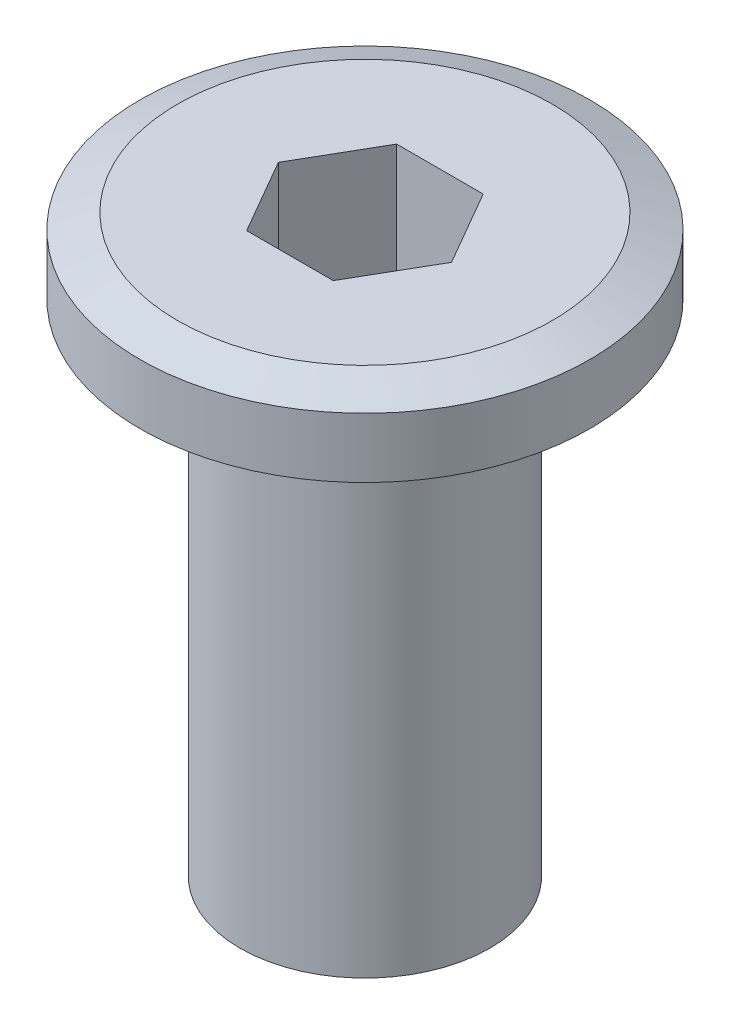
ISO-10303-21;
HEADER;
FILE_DESCRIPTION(('STEP AP214'),'2;1');
FILE_NAME('part.step','',(''),(''),'','','');
FILE_SCHEMA(('AUTOMOTIVE_DESIGN { 1 0 10303 214 1 1 1 1 }'));
ENDSEC;
DATA;
#1=APPLICATION_CONTEXT('core data for automotive mechanical design processes');
#2=APPLICATION_PROTOCOL_DEFINITION('international standard','automotive_design',2000,#1);
#3=PRODUCT_CONTEXT('',#1,'mechanical');
#4=PRODUCT('Part','Part','',(#3));
#5=PRODUCT_RELATED_PRODUCT_CATEGORY('part','',(#4));
#6=PRODUCT_DEFINITION_FORMATION('','',#4);
#7=PRODUCT_DEFINITION_CONTEXT('part definition',#1,'design');
#8=PRODUCT_DEFINITION('design','',#6,#7);
#9=PRODUCT_DEFINITION_SHAPE('','',#8);
#10=(LENGTH_UNIT() NAMED_UNIT(*) SI_UNIT(.MILLI.,.METRE.));
#11=(NAMED_UNIT(*) PLANE_ANGLE_UNIT() SI_UNIT($,.RADIAN.));
#12=(NAMED_UNIT(*) SI_UNIT($,.STERADIAN.) SOLID_ANGLE_UNIT());
#13=UNCERTAINTY_MEASURE_WITH_UNIT(LENGTH_MEASURE(1.E-05),#10,'distance_accuracy_value','');
#14=(GEOMETRIC_REPRESENTATION_CONTEXT(3) GLOBAL_UNCERTAINTY_ASSIGNED_CONTEXT((#13)) GLOBAL_UNIT_ASSIGNED_CONTEXT((#10,
#11,#12)) REPRESENTATION_CONTEXT('',''));
#15=CARTESIAN_POINT('',(0.,0.,0.));
#16=DIRECTION('',(0.,0.,1.));
#17=DIRECTION('',(1.,0.,0.));
#18=AXIS2_PLACEMENT_3D('',#15,#16,#17);
#19=CARTESIAN_POINT('',(0.,1.2,0.));
#20=DIRECTION('',(0.,-1.,0.));
#21=DIRECTION('',(0.,0.,-1.));
#22=AXIS2_PLACEMENT_3D('',#19,#20,#21);
#23=CONICAL_SURFACE('',#22,4.5,1.19028994968253);
#24=CARTESIAN_POINT('',(0.,1.5,0.));
#25=DIRECTION('',(0.,-1.,0.));
#26=DIRECTION('',(0.,0.,-1.));
#27=AXIS2_PLACEMENT_3D('',#24,#25,#26);
#28=CIRCLE('',#27,3.75);
#29=CARTESIAN_POINT('',(0.,1.5,-3.75));
#30=VERTEX_POINT('',#29);
#31=EDGE_CURVE('E146',#30,#30,#28,.T.);
#32=ORIENTED_EDGE('',*,*,#31,.T.);
#33=EDGE_LOOP('',(#32));
#34=FACE_BOUND('',#33,.T.);
#35=CARTESIAN_POINT('',(0.,1.2,0.));
#36=DIRECTION('',(0.,-1.,0.));
#37=DIRECTION('',(0.,0.,-1.));
#38=AXIS2_PLACEMENT_3D('',#35,#36,#37);
#39=CIRCLE('',#38,4.5);
#40=CARTESIAN_POINT('',(0.,1.2,-4.5));
#41=VERTEX_POINT('',#40);
#42=EDGE_CURVE('E44',#41,#41,#39,.T.);
#43=ORIENTED_EDGE('',*,*,#42,.F.);
#44=EDGE_LOOP('',(#43));
#45=FACE_BOUND('',#44,.T.);
#46=ADVANCED_FACE('F37',(#34,#45),#23,.T.);
#47=CARTESIAN_POINT('',(0.,0.,0.));
#48=DIRECTION('',(0.,-1.,0.));
#49=DIRECTION('',(0.,0.,-1.));
#50=AXIS2_PLACEMENT_3D('',#47,#48,#49);
#51=CYLINDRICAL_SURFACE('',#50,4.5);
#52=ORIENTED_EDGE('',*,*,#42,.T.);
#53=EDGE_LOOP('',(#52));
#54=FACE_BOUND('',#53,.T.);
#55=CARTESIAN_POINT('',(0.,0.,0.));
#56=DIRECTION('',(0.,-1.,0.));
#57=DIRECTION('',(0.,0.,-1.));
#58=AXIS2_PLACEMENT_3D('',#55,#56,#57);
#59=CIRCLE('',#58,4.5);
#60=CARTESIAN_POINT('',(0.,0.,-4.5));
#61=VERTEX_POINT('',#60);
#62=EDGE_CURVE('E149',#61,#61,#59,.T.);
#63=ORIENTED_EDGE('',*,*,#62,.F.);
#64=EDGE_LOOP('',(#63));
#65=FACE_BOUND('',#64,.T.);
#66=ADVANCED_FACE('F154',(#54,#65),#51,.T.);
#67=CARTESIAN_POINT('',(0.,0.,0.));
#68=DIRECTION('',(0.,1.,0.));
#69=DIRECTION('',(0.,0.,1.));
#70=AXIS2_PLACEMENT_3D('',#67,#68,#69);
#71=PLANE('',#70);
#72=CARTESIAN_POINT('',(0.,0.,0.));
#73=DIRECTION('',(0.,1.,0.));
#74=DIRECTION('',(0.,0.,1.));
#75=AXIS2_PLACEMENT_3D('',#72,#73,#74);
#76=CIRCLE('',#75,2.5);
#77=CARTESIAN_POINT('',(0.,0.,2.5));
#78=VERTEX_POINT('',#77);
#79=EDGE_CURVE('E11',#78,#78,#76,.F.);
#80=ORIENTED_EDGE('',*,*,#79,.F.);
#81=EDGE_LOOP('',(#80));
#82=FACE_BOUND('',#81,.T.);
#83=ORIENTED_EDGE('',*,*,#62,.T.);
#84=EDGE_LOOP('',(#83));
#85=FACE_BOUND('',#84,.T.);
#86=ADVANCED_FACE('F162',(#82,#85),#71,.F.);
#87=CARTESIAN_POINT('',(0.,1.5,0.));
#88=DIRECTION('',(0.,1.,0.));
#89=DIRECTION('',(0.,0.,1.));
#90=AXIS2_PLACEMENT_3D('',#87,#88,#89);
#91=PLANE('',#90);
#92=DIRECTION('',(0.5,0.,-0.866025403784439));
#93=VECTOR('',#92,1.);
#94=CARTESIAN_POINT('',(0.866025403784439,1.5,1.5));
#95=LINE('',#94,#93);
#96=CARTESIAN_POINT('',(0.866025403784439,1.5,1.5));
#97=VERTEX_POINT('',#96);
#98=CARTESIAN_POINT('',(1.73205080756888,1.5,0.));
#99=VERTEX_POINT('',#98);
#100=EDGE_CURVE('E51',#97,#99,#95,.T.);
#101=ORIENTED_EDGE('',*,*,#100,.F.);
#102=DIRECTION('',(1.,0.,0.));
#103=VECTOR('',#102,1.);
#104=CARTESIAN_POINT('',(-0.866025403784439,1.5,1.5));
#105=LINE('',#104,#103);
#106=CARTESIAN_POINT('',(-0.866025403784439,1.5,1.5));
#107=VERTEX_POINT('',#106);
#108=EDGE_CURVE('E134',#107,#97,#105,.T.);
#109=ORIENTED_EDGE('',*,*,#108,.F.);
#110=DIRECTION('',(0.5,0.,0.866025403784439));
#111=VECTOR('',#110,1.);
#112=CARTESIAN_POINT('',(-1.73205080756888,1.5,0.));
#113=LINE('',#112,#111);
#114=CARTESIAN_POINT('',(-1.73205080756888,1.5,0.));
#115=VERTEX_POINT('',#114);
#116=EDGE_CURVE('E132',#115,#107,#113,.T.);
#117=ORIENTED_EDGE('',*,*,#116,.F.);
#118=DIRECTION('',(-0.5,0.,0.866025403784439));
#119=VECTOR('',#118,1.);
#120=CARTESIAN_POINT('',(-0.866025403784439,1.5,-1.5));
#121=LINE('',#120,#119);
#122=CARTESIAN_POINT('',(-0.866025403784439,1.5,-1.5));
#123=VERTEX_POINT('',#122);
#124=EDGE_CURVE('E99',#123,#115,#121,.T.);
#125=ORIENTED_EDGE('',*,*,#124,.F.);
#126=DIRECTION('',(-1.,0.,0.));
#127=VECTOR('',#126,1.);
#128=CARTESIAN_POINT('',(0.866025403784439,1.5,-1.5));
#129=LINE('',#128,#127);
#130=CARTESIAN_POINT('',(0.866025403784439,1.5,-1.5));
#131=VERTEX_POINT('',#130);
#132=EDGE_CURVE('E128',#131,#123,#129,.T.);
#133=ORIENTED_EDGE('',*,*,#132,.F.);
#134=DIRECTION('',(-0.5,0.,-0.866025403784438));
#135=VECTOR('',#134,1.);
#136=CARTESIAN_POINT('',(1.73205080756888,1.5,0.));
#137=LINE('',#136,#135);
#138=EDGE_CURVE('E125',#99,#131,#137,.T.);
#139=ORIENTED_EDGE('',*,*,#138,.F.);
#140=EDGE_LOOP('',(#101,#109,#117,#125,#133,#139));
#141=FACE_BOUND('',#140,.T.);
#142=ORIENTED_EDGE('',*,*,#31,.F.);
#143=EDGE_LOOP('',(#142));
#144=FACE_BOUND('',#143,.T.);
#145=ADVANCED_FACE('F165',(#141,#144),#91,.T.);
#146=CARTESIAN_POINT('',(0.,-10.,0.));
#147=DIRECTION('',(0.,1.,0.));
#148=DIRECTION('',(0.,0.,1.));
#149=AXIS2_PLACEMENT_3D('',#146,#147,#148);
#150=CYLINDRICAL_SURFACE('',#149,2.5);
#151=CARTESIAN_POINT('',(0.,-10.,0.));
#152=DIRECTION('',(0.,-1.,0.));
#153=DIRECTION('',(0.,0.,-1.));
#154=AXIS2_PLACEMENT_3D('',#151,#152,#153);
#155=CIRCLE('',#154,2.5);
#156=CARTESIAN_POINT('',(0.,-10.,-2.5));
#157=VERTEX_POINT('',#156);
#158=EDGE_CURVE('E138',#157,#157,#155,.T.);
#159=ORIENTED_EDGE('',*,*,#158,.F.);
#160=EDGE_LOOP('',(#159));
#161=FACE_BOUND('',#160,.T.);
#162=ORIENTED_EDGE('',*,*,#79,.T.);
#163=EDGE_LOOP('',(#162));
#164=FACE_BOUND('',#163,.T.);
#165=ADVANCED_FACE('F167',(#161,#164),#150,.T.);
#166=CARTESIAN_POINT('',(0.,-10.,0.));
#167=DIRECTION('',(0.,-1.,0.));
#168=DIRECTION('',(0.,0.,-1.));
#169=AXIS2_PLACEMENT_3D('',#166,#167,#168);
#170=PLANE('',#169);
#171=ORIENTED_EDGE('',*,*,#158,.T.);
#172=EDGE_LOOP('',(#171));
#173=FACE_BOUND('',#172,.T.);
#174=ADVANCED_FACE('F174',(#173),#170,.T.);
#175=CARTESIAN_POINT('',(0.866025403784439,-1.5,1.5));
#176=DIRECTION('',(0.866025403784439,0.,0.5));
#177=DIRECTION('',(0.5,0.,-0.866025403784439));
#178=AXIS2_PLACEMENT_3D('',#175,#176,#177);
#179=PLANE('',#178);
#180=ORIENTED_EDGE('',*,*,#100,.T.);
#181=DIRECTION('',(0.,1.,0.));
#182=VECTOR('',#181,1.);
#183=CARTESIAN_POINT('',(1.73205080756888,-1.5,0.));
#184=LINE('',#183,#182);
#185=CARTESIAN_POINT('',(1.73205080756888,-1.5,0.));
#186=VERTEX_POINT('',#185);
#187=EDGE_CURVE('E81',#186,#99,#184,.T.);
#188=ORIENTED_EDGE('',*,*,#187,.F.);
#189=DIRECTION('',(0.5,0.,-0.866025403784439));
#190=VECTOR('',#189,1.);
#191=CARTESIAN_POINT('',(0.866025403784439,-1.5,1.5));
#192=LINE('',#191,#190);
#193=CARTESIAN_POINT('',(0.866025403784439,-1.5,1.5));
#194=VERTEX_POINT('',#193);
#195=EDGE_CURVE('E136',#194,#186,#192,.T.);
#196=ORIENTED_EDGE('',*,*,#195,.F.);
#197=DIRECTION('',(0.,1.,0.));
#198=VECTOR('',#197,1.);
#199=CARTESIAN_POINT('',(0.866025403784439,-1.5,1.5));
#200=LINE('',#199,#198);
#201=EDGE_CURVE('E59',#194,#97,#200,.T.);
#202=ORIENTED_EDGE('',*,*,#201,.T.);
#203=EDGE_LOOP('',(#180,#188,#196,#202));
#204=FACE_BOUND('',#203,.T.);
#205=ADVANCED_FACE('F182',(#204),#179,.F.);
#206=CARTESIAN_POINT('',(-0.866025403784439,-1.5,1.5));
#207=DIRECTION('',(0.,0.,1.));
#208=DIRECTION('',(1.,0.,0.));
#209=AXIS2_PLACEMENT_3D('',#206,#207,#208);
#210=PLANE('',#209);
#211=ORIENTED_EDGE('',*,*,#108,.T.);
#212=ORIENTED_EDGE('',*,*,#201,.F.);
#213=DIRECTION('',(1.,0.,0.));
#214=VECTOR('',#213,1.);
#215=CARTESIAN_POINT('',(-0.866025403784439,-1.5,1.5));
#216=LINE('',#215,#214);
#217=CARTESIAN_POINT('',(-0.866025403784439,-1.5,1.5));
#218=VERTEX_POINT('',#217);
#219=EDGE_CURVE('E111',#218,#194,#216,.T.);
#220=ORIENTED_EDGE('',*,*,#219,.F.);
#221=DIRECTION('',(0.,1.,0.));
#222=VECTOR('',#221,1.);
#223=CARTESIAN_POINT('',(-0.866025403784439,-1.5,1.5));
#224=LINE('',#223,#222);
#225=EDGE_CURVE('E103',#218,#107,#224,.T.);
#226=ORIENTED_EDGE('',*,*,#225,.T.);
#227=EDGE_LOOP('',(#211,#212,#220,#226));
#228=FACE_BOUND('',#227,.T.);
#229=ADVANCED_FACE('F186',(#228),#210,.F.);
#230=CARTESIAN_POINT('',(-1.73205080756888,-1.5,0.));
#231=DIRECTION('',(-0.866025403784439,0.,0.5));
#232=DIRECTION('',(0.5,0.,0.866025403784439));
#233=AXIS2_PLACEMENT_3D('',#230,#231,#232);
#234=PLANE('',#233);
#235=ORIENTED_EDGE('',*,*,#116,.T.);
#236=ORIENTED_EDGE('',*,*,#225,.F.);
#237=DIRECTION('',(0.5,0.,0.866025403784439));
#238=VECTOR('',#237,1.);
#239=CARTESIAN_POINT('',(-1.73205080756888,-1.5,0.));
#240=LINE('',#239,#238);
#241=CARTESIAN_POINT('',(-1.73205080756888,-1.5,0.));
#242=VERTEX_POINT('',#241);
#243=EDGE_CURVE('E107',#242,#218,#240,.T.);
#244=ORIENTED_EDGE('',*,*,#243,.F.);
#245=DIRECTION('',(0.,1.,0.));
#246=VECTOR('',#245,1.);
#247=CARTESIAN_POINT('',(-1.73205080756888,-1.5,0.));
#248=LINE('',#247,#246);
#249=EDGE_CURVE('E92',#242,#115,#248,.T.);
#250=ORIENTED_EDGE('',*,*,#249,.T.);
#251=EDGE_LOOP('',(#235,#236,#244,#250));
#252=FACE_BOUND('',#251,.T.);
#253=ADVANCED_FACE('F108',(#252),#234,.F.);
#254=CARTESIAN_POINT('',(-0.866025403784439,-1.5,-1.5));
#255=DIRECTION('',(-0.866025403784439,0.,-0.5));
#256=DIRECTION('',(-0.5,0.,0.866025403784439));
#257=AXIS2_PLACEMENT_3D('',#254,#255,#256);
#258=PLANE('',#257);
#259=ORIENTED_EDGE('',*,*,#124,.T.);
#260=ORIENTED_EDGE('',*,*,#249,.F.);
#261=DIRECTION('',(-0.5,0.,0.866025403784439));
#262=VECTOR('',#261,1.);
#263=CARTESIAN_POINT('',(-0.866025403784439,-1.5,-1.5));
#264=LINE('',#263,#262);
#265=CARTESIAN_POINT('',(-0.866025403784439,-1.5,-1.5));
#266=VERTEX_POINT('',#265);
#267=EDGE_CURVE('E96',#266,#242,#264,.T.);
#268=ORIENTED_EDGE('',*,*,#267,.F.);
#269=DIRECTION('',(0.,1.,0.));
#270=VECTOR('',#269,1.);
#271=CARTESIAN_POINT('',(-0.866025403784439,-1.5,-1.5));
#272=LINE('',#271,#270);
#273=EDGE_CURVE('E104',#266,#123,#272,.T.);
#274=ORIENTED_EDGE('',*,*,#273,.T.);
#275=EDGE_LOOP('',(#259,#260,#268,#274));
#276=FACE_BOUND('',#275,.T.);
#277=ADVANCED_FACE('F94',(#276),#258,.F.);
#278=CARTESIAN_POINT('',(0.866025403784439,-1.5,-1.5));
#279=DIRECTION('',(0.,0.,-1.));
#280=DIRECTION('',(-1.,0.,0.));
#281=AXIS2_PLACEMENT_3D('',#278,#279,#280);
#282=PLANE('',#281);
#283=ORIENTED_EDGE('',*,*,#132,.T.);
#284=ORIENTED_EDGE('',*,*,#273,.F.);
#285=DIRECTION('',(-1.,0.,0.));
#286=VECTOR('',#285,1.);
#287=CARTESIAN_POINT('',(0.866025403784439,-1.5,-1.5));
#288=LINE('',#287,#286);
#289=CARTESIAN_POINT('',(0.866025403784439,-1.5,-1.5));
#290=VERTEX_POINT('',#289);
#291=EDGE_CURVE('E117',#290,#266,#288,.T.);
#292=ORIENTED_EDGE('',*,*,#291,.F.);
#293=DIRECTION('',(0.,1.,0.));
#294=VECTOR('',#293,1.);
#295=CARTESIAN_POINT('',(0.866025403784439,-1.5,-1.5));
#296=LINE('',#295,#294);
#297=EDGE_CURVE('E141',#290,#131,#296,.T.);
#298=ORIENTED_EDGE('',*,*,#297,.T.);
#299=EDGE_LOOP('',(#283,#284,#292,#298));
#300=FACE_BOUND('',#299,.T.);
#301=ADVANCED_FACE('F190',(#300),#282,.F.);
#302=CARTESIAN_POINT('',(1.73205080756888,-1.5,0.));
#303=DIRECTION('',(0.866025403784439,0.,-0.5));
#304=DIRECTION('',(-0.5,0.,-0.866025403784439));
#305=AXIS2_PLACEMENT_3D('',#302,#303,#304);
#306=PLANE('',#305);
#307=ORIENTED_EDGE('',*,*,#138,.T.);
#308=ORIENTED_EDGE('',*,*,#297,.F.);
#309=DIRECTION('',(-0.5,0.,-0.866025403784438));
#310=VECTOR('',#309,1.);
#311=CARTESIAN_POINT('',(1.73205080756888,-1.5,0.));
#312=LINE('',#311,#310);
#313=EDGE_CURVE('E119',#186,#290,#312,.T.);
#314=ORIENTED_EDGE('',*,*,#313,.F.);
#315=ORIENTED_EDGE('',*,*,#187,.T.);
#316=EDGE_LOOP('',(#307,#308,#314,#315));
#317=FACE_BOUND('',#316,.T.);
#318=ADVANCED_FACE('F187',(#317),#306,.F.);
#319=CARTESIAN_POINT('',(0.,-1.5,0.));
#320=DIRECTION('',(0.,1.,0.));
#321=DIRECTION('',(0.,0.,1.));
#322=AXIS2_PLACEMENT_3D('',#319,#320,#321);
#323=PLANE('',#322);
#324=ORIENTED_EDGE('',*,*,#195,.T.);
#325=ORIENTED_EDGE('',*,*,#313,.T.);
#326=ORIENTED_EDGE('',*,*,#291,.T.);
#327=ORIENTED_EDGE('',*,*,#267,.T.);
#328=ORIENTED_EDGE('',*,*,#243,.T.);
#329=ORIENTED_EDGE('',*,*,#219,.T.);
#330=EDGE_LOOP('',(#324,#325,#326,#327,#328,#329));
#331=FACE_BOUND('',#330,.T.);
#332=ADVANCED_FACE('F114',(#331),#323,.T.);
#333=CLOSED_SHELL('',(#46,#66,#86,#145,#165,#174,#205,#229,#253,#277,#301,#318,#332));
#334=MANIFOLD_SOLID_BREP('B2',#333);
#335=ADVANCED_BREP_SHAPE_REPRESENTATION('',(#18,#334),#14);
#336=SHAPE_DEFINITION_REPRESENTATION(#9,#335);
ENDSEC;
END-ISO-10303-21;
